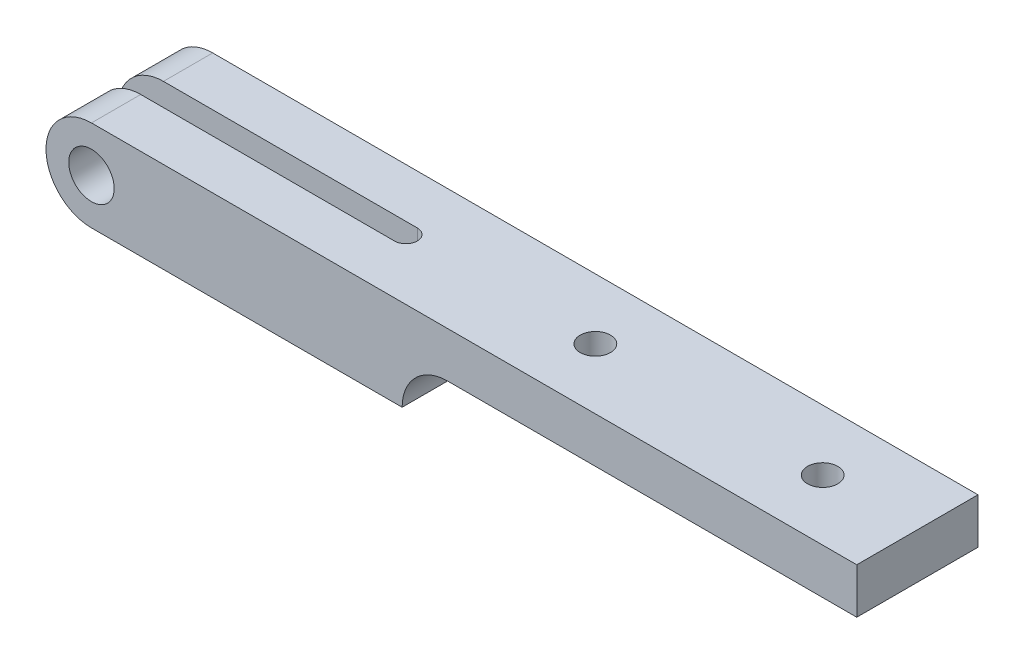
ISO-10303-21;
HEADER;
FILE_DESCRIPTION(('STEP AP214'),'2;1');
FILE_NAME('part.step','',(''),(''),'','','');
FILE_SCHEMA(('AUTOMOTIVE_DESIGN { 1 0 10303 214 1 1 1 1 }'));
ENDSEC;
DATA;
#1=APPLICATION_CONTEXT('core data for automotive mechanical design processes');
#2=APPLICATION_PROTOCOL_DEFINITION('international standard','automotive_design',2000,#1);
#3=PRODUCT_CONTEXT('',#1,'mechanical');
#4=PRODUCT('Part','Part','',(#3));
#5=PRODUCT_RELATED_PRODUCT_CATEGORY('part','',(#4));
#6=PRODUCT_DEFINITION_FORMATION('','',#4);
#7=PRODUCT_DEFINITION_CONTEXT('part definition',#1,'design');
#8=PRODUCT_DEFINITION('design','',#6,#7);
#9=PRODUCT_DEFINITION_SHAPE('','',#8);
#10=(LENGTH_UNIT() NAMED_UNIT(*) SI_UNIT(.MILLI.,.METRE.));
#11=(NAMED_UNIT(*) PLANE_ANGLE_UNIT() SI_UNIT($,.RADIAN.));
#12=(NAMED_UNIT(*) SI_UNIT($,.STERADIAN.) SOLID_ANGLE_UNIT());
#13=UNCERTAINTY_MEASURE_WITH_UNIT(LENGTH_MEASURE(1.E-05),#10,'distance_accuracy_value','');
#14=(GEOMETRIC_REPRESENTATION_CONTEXT(3) GLOBAL_UNCERTAINTY_ASSIGNED_CONTEXT((#13)) GLOBAL_UNIT_ASSIGNED_CONTEXT((#10,
#11,#12)) REPRESENTATION_CONTEXT('',''));
#15=CARTESIAN_POINT('',(0.,0.,0.));
#16=DIRECTION('',(0.,0.,1.));
#17=DIRECTION('',(1.,0.,0.));
#18=AXIS2_PLACEMENT_3D('',#15,#16,#17);
#19=CARTESIAN_POINT('',(0.,0.,8.));
#20=DIRECTION('',(0.,0.,-1.));
#21=DIRECTION('',(-1.,0.,0.));
#22=AXIS2_PLACEMENT_3D('',#19,#20,#21);
#23=CYLINDRICAL_SURFACE('',#22,3.);
#24=CARTESIAN_POINT('',(0.,0.,-1.5));
#25=DIRECTION('',(0.,0.,-1.));
#26=DIRECTION('',(-1.,0.,0.));
#27=AXIS2_PLACEMENT_3D('',#24,#25,#26);
#28=CIRCLE('',#27,3.);
#29=CARTESIAN_POINT('',(-3.,0.,-1.5));
#30=VERTEX_POINT('',#29);
#31=EDGE_CURVE('E223',#30,#30,#28,.T.);
#32=ORIENTED_EDGE('',*,*,#31,.F.);
#33=EDGE_LOOP('',(#32));
#34=FACE_BOUND('',#33,.T.);
#35=CARTESIAN_POINT('',(0.,0.,-8.));
#36=DIRECTION('',(0.,0.,1.));
#37=DIRECTION('',(1.,0.,0.));
#38=AXIS2_PLACEMENT_3D('',#35,#36,#37);
#39=CIRCLE('',#38,3.);
#40=CARTESIAN_POINT('',(3.,0.,-8.));
#41=VERTEX_POINT('',#40);
#42=EDGE_CURVE('E136',#41,#41,#39,.T.);
#43=ORIENTED_EDGE('',*,*,#42,.F.);
#44=EDGE_LOOP('',(#43));
#45=FACE_BOUND('',#44,.T.);
#46=ADVANCED_FACE('F35',(#34,#45),#23,.F.);
#47=CARTESIAN_POINT('',(0.,0.,8.));
#48=DIRECTION('',(0.,0.,-1.));
#49=DIRECTION('',(-1.,0.,0.));
#50=AXIS2_PLACEMENT_3D('',#47,#48,#49);
#51=CYLINDRICAL_SURFACE('',#50,6.);
#52=CARTESIAN_POINT('',(0.,0.,-1.5));
#53=DIRECTION('',(0.,0.,-1.));
#54=DIRECTION('',(-1.,0.,0.));
#55=AXIS2_PLACEMENT_3D('',#52,#53,#54);
#56=CIRCLE('',#55,6.);
#57=CARTESIAN_POINT('',(0.,-6.,-1.5));
#58=VERTEX_POINT('',#57);
#59=CARTESIAN_POINT('',(0.,6.,-1.5));
#60=VERTEX_POINT('',#59);
#61=EDGE_CURVE('E11',#58,#60,#56,.T.);
#62=ORIENTED_EDGE('',*,*,#61,.T.);
#63=DIRECTION('',(0.,0.,-1.));
#64=VECTOR('',#63,1.);
#65=CARTESIAN_POINT('',(0.,6.,8.));
#66=LINE('',#65,#64);
#67=CARTESIAN_POINT('',(0.,6.,-8.));
#68=VERTEX_POINT('',#67);
#69=EDGE_CURVE('E157',#60,#68,#66,.T.);
#70=ORIENTED_EDGE('',*,*,#69,.T.);
#71=CARTESIAN_POINT('',(0.,0.,-8.));
#72=DIRECTION('',(0.,0.,1.));
#73=DIRECTION('',(1.,0.,0.));
#74=AXIS2_PLACEMENT_3D('',#71,#72,#73);
#75=CIRCLE('',#74,6.);
#76=CARTESIAN_POINT('',(0.,-6.,-8.));
#77=VERTEX_POINT('',#76);
#78=EDGE_CURVE('E151',#68,#77,#75,.T.);
#79=ORIENTED_EDGE('',*,*,#78,.T.);
#80=DIRECTION('',(0.,0.,-1.));
#81=VECTOR('',#80,1.);
#82=CARTESIAN_POINT('',(0.,-6.,8.));
#83=LINE('',#82,#81);
#84=EDGE_CURVE('E88',#58,#77,#83,.T.);
#85=ORIENTED_EDGE('',*,*,#84,.F.);
#86=EDGE_LOOP('',(#62,#70,#79,#85));
#87=FACE_BOUND('',#86,.T.);
#88=ADVANCED_FACE('F192',(#87),#51,.T.);
#89=CARTESIAN_POINT('',(0.,-6.,8.));
#90=DIRECTION('',(0.,1.,0.));
#91=DIRECTION('',(0.,0.,1.));
#92=AXIS2_PLACEMENT_3D('',#89,#90,#91);
#93=PLANE('',#92);
#94=CARTESIAN_POINT('',(33.5,-6.,0.));
#95=DIRECTION('',(0.,1.,0.));
#96=DIRECTION('',(0.,0.,-1.));
#97=AXIS2_PLACEMENT_3D('',#94,#95,#96);
#98=CIRCLE('',#97,1.50000000000007);
#99=CARTESIAN_POINT('',(33.4999995303875,-6.,1.5));
#100=VERTEX_POINT('',#99);
#101=CARTESIAN_POINT('',(33.4999995303875,-6.,-1.5));
#102=VERTEX_POINT('',#101);
#103=EDGE_CURVE('E203',#100,#102,#98,.T.);
#104=ORIENTED_EDGE('',*,*,#103,.T.);
#105=DIRECTION('',(-1.,0.,0.));
#106=VECTOR('',#105,1.);
#107=CARTESIAN_POINT('',(33.4999995303875,-6.,-1.5));
#108=LINE('',#107,#106);
#109=EDGE_CURVE('E214',#102,#58,#108,.T.);
#110=ORIENTED_EDGE('',*,*,#109,.T.);
#111=ORIENTED_EDGE('',*,*,#84,.T.);
#112=DIRECTION('',(1.,0.,0.));
#113=VECTOR('',#112,1.);
#114=CARTESIAN_POINT('',(0.,-6.,-8.));
#115=LINE('',#114,#113);
#116=CARTESIAN_POINT('',(41.,-6.,-8.));
#117=VERTEX_POINT('',#116);
#118=EDGE_CURVE('E139',#77,#117,#115,.T.);
#119=ORIENTED_EDGE('',*,*,#118,.T.);
#120=DIRECTION('',(0.,0.,-1.));
#121=VECTOR('',#120,1.);
#122=CARTESIAN_POINT('',(41.,-6.,8.));
#123=LINE('',#122,#121);
#124=CARTESIAN_POINT('',(41.,-6.,8.));
#125=VERTEX_POINT('',#124);
#126=EDGE_CURVE('E162',#125,#117,#123,.T.);
#127=ORIENTED_EDGE('',*,*,#126,.F.);
#128=DIRECTION('',(1.,0.,0.));
#129=VECTOR('',#128,1.);
#130=CARTESIAN_POINT('',(0.,-6.,8.));
#131=LINE('',#130,#129);
#132=CARTESIAN_POINT('',(0.,-6.,8.));
#133=VERTEX_POINT('',#132);
#134=EDGE_CURVE('E172',#133,#125,#131,.T.);
#135=ORIENTED_EDGE('',*,*,#134,.F.);
#136=CARTESIAN_POINT('',(0.,-6.,1.5));
#137=VERTEX_POINT('',#136);
#138=EDGE_CURVE('E154',#133,#137,#83,.T.);
#139=ORIENTED_EDGE('',*,*,#138,.T.);
#140=DIRECTION('',(1.,0.,0.));
#141=VECTOR('',#140,1.);
#142=CARTESIAN_POINT('',(33.4999995303875,-6.,1.5));
#143=LINE('',#142,#141);
#144=EDGE_CURVE('E50',#137,#100,#143,.T.);
#145=ORIENTED_EDGE('',*,*,#144,.T.);
#146=EDGE_LOOP('',(#104,#110,#111,#119,#127,#135,#139,#145));
#147=FACE_BOUND('',#146,.T.);
#148=ADVANCED_FACE('F169',(#147),#93,.F.);
#149=CARTESIAN_POINT('',(47.,-6.,8.));
#150=DIRECTION('',(0.,0.,-1.));
#151=DIRECTION('',(-1.,0.,0.));
#152=AXIS2_PLACEMENT_3D('',#149,#150,#151);
#153=CYLINDRICAL_SURFACE('',#152,6.);
#154=CARTESIAN_POINT('',(47.,-6.,-8.));
#155=DIRECTION('',(0.,0.,1.));
#156=DIRECTION('',(1.,0.,0.));
#157=AXIS2_PLACEMENT_3D('',#154,#155,#156);
#158=CIRCLE('',#157,6.);
#159=CARTESIAN_POINT('',(47.,0.,-8.));
#160=VERTEX_POINT('',#159);
#161=EDGE_CURVE('E142',#117,#160,#158,.F.);
#162=ORIENTED_EDGE('',*,*,#161,.T.);
#163=DIRECTION('',(0.,0.,-1.));
#164=VECTOR('',#163,1.);
#165=CARTESIAN_POINT('',(47.,0.,8.));
#166=LINE('',#165,#164);
#167=CARTESIAN_POINT('',(47.,0.,8.));
#168=VERTEX_POINT('',#167);
#169=EDGE_CURVE('E160',#168,#160,#166,.T.);
#170=ORIENTED_EDGE('',*,*,#169,.F.);
#171=CARTESIAN_POINT('',(47.,-6.,8.));
#172=DIRECTION('',(0.,0.,1.));
#173=DIRECTION('',(1.,0.,0.));
#174=AXIS2_PLACEMENT_3D('',#171,#172,#173);
#175=CIRCLE('',#174,6.);
#176=EDGE_CURVE('E97',#125,#168,#175,.F.);
#177=ORIENTED_EDGE('',*,*,#176,.F.);
#178=ORIENTED_EDGE('',*,*,#126,.T.);
#179=EDGE_LOOP('',(#162,#170,#177,#178));
#180=FACE_BOUND('',#179,.T.);
#181=ADVANCED_FACE('F236',(#180),#153,.F.);
#182=CARTESIAN_POINT('',(0.,0.,8.));
#183=DIRECTION('',(0.,-1.,0.));
#184=DIRECTION('',(1.,0.,0.));
#185=AXIS2_PLACEMENT_3D('',#182,#183,#184);
#186=PLANE('',#185);
#187=CARTESIAN_POINT('',(58.5,0.,0.));
#188=DIRECTION('',(0.,-1.,0.));
#189=DIRECTION('',(1.,0.,0.));
#190=AXIS2_PLACEMENT_3D('',#187,#188,#189);
#191=CIRCLE('',#190,2.);
#192=CARTESIAN_POINT('',(60.5,0.,0.));
#193=VERTEX_POINT('',#192);
#194=EDGE_CURVE('E140',#193,#193,#191,.T.);
#195=ORIENTED_EDGE('',*,*,#194,.F.);
#196=EDGE_LOOP('',(#195));
#197=FACE_BOUND('',#196,.T.);
#198=CARTESIAN_POINT('',(88.5,0.,0.));
#199=DIRECTION('',(0.,-1.,0.));
#200=DIRECTION('',(1.,0.,0.));
#201=AXIS2_PLACEMENT_3D('',#198,#199,#200);
#202=CIRCLE('',#201,2.);
#203=CARTESIAN_POINT('',(90.5,0.,0.));
#204=VERTEX_POINT('',#203);
#205=EDGE_CURVE('E226',#204,#204,#202,.T.);
#206=ORIENTED_EDGE('',*,*,#205,.F.);
#207=EDGE_LOOP('',(#206));
#208=FACE_BOUND('',#207,.T.);
#209=DIRECTION('',(-1.,0.,0.));
#210=VECTOR('',#209,1.);
#211=CARTESIAN_POINT('',(0.,0.,-8.));
#212=LINE('',#211,#210);
#213=CARTESIAN_POINT('',(101.,0.,-8.));
#214=VERTEX_POINT('',#213);
#215=EDGE_CURVE('E145',#214,#160,#212,.T.);
#216=ORIENTED_EDGE('',*,*,#215,.F.);
#217=DIRECTION('',(0.,0.,-1.));
#218=VECTOR('',#217,1.);
#219=CARTESIAN_POINT('',(101.,0.,8.));
#220=LINE('',#219,#218);
#221=CARTESIAN_POINT('',(101.,0.,8.));
#222=VERTEX_POINT('',#221);
#223=EDGE_CURVE('E124',#222,#214,#220,.T.);
#224=ORIENTED_EDGE('',*,*,#223,.F.);
#225=DIRECTION('',(-1.,0.,0.));
#226=VECTOR('',#225,1.);
#227=CARTESIAN_POINT('',(0.,0.,8.));
#228=LINE('',#227,#226);
#229=EDGE_CURVE('E113',#222,#168,#228,.T.);
#230=ORIENTED_EDGE('',*,*,#229,.T.);
#231=ORIENTED_EDGE('',*,*,#169,.T.);
#232=EDGE_LOOP('',(#216,#224,#230,#231));
#233=FACE_BOUND('',#232,.T.);
#234=ADVANCED_FACE('F180',(#197,#208,#233),#186,.T.);
#235=CARTESIAN_POINT('',(101.,0.,8.));
#236=DIRECTION('',(-1.,0.,0.));
#237=DIRECTION('',(0.,0.,1.));
#238=AXIS2_PLACEMENT_3D('',#235,#236,#237);
#239=PLANE('',#238);
#240=DIRECTION('',(0.,1.,0.));
#241=VECTOR('',#240,1.);
#242=CARTESIAN_POINT('',(101.,0.,-8.));
#243=LINE('',#242,#241);
#244=CARTESIAN_POINT('',(101.,6.,-8.));
#245=VERTEX_POINT('',#244);
#246=EDGE_CURVE('E120',#214,#245,#243,.T.);
#247=ORIENTED_EDGE('',*,*,#246,.T.);
#248=DIRECTION('',(0.,0.,-1.));
#249=VECTOR('',#248,1.);
#250=CARTESIAN_POINT('',(101.,6.,8.));
#251=LINE('',#250,#249);
#252=CARTESIAN_POINT('',(101.,6.,8.));
#253=VERTEX_POINT('',#252);
#254=EDGE_CURVE('E117',#253,#245,#251,.T.);
#255=ORIENTED_EDGE('',*,*,#254,.F.);
#256=DIRECTION('',(0.,1.,0.));
#257=VECTOR('',#256,1.);
#258=CARTESIAN_POINT('',(101.,0.,8.));
#259=LINE('',#258,#257);
#260=EDGE_CURVE('E107',#222,#253,#259,.T.);
#261=ORIENTED_EDGE('',*,*,#260,.F.);
#262=ORIENTED_EDGE('',*,*,#223,.T.);
#263=EDGE_LOOP('',(#247,#255,#261,#262));
#264=FACE_BOUND('',#263,.T.);
#265=ADVANCED_FACE('F118',(#264),#239,.F.);
#266=CARTESIAN_POINT('',(0.,6.,8.));
#267=DIRECTION('',(0.,1.,0.));
#268=DIRECTION('',(0.,0.,1.));
#269=AXIS2_PLACEMENT_3D('',#266,#267,#268);
#270=PLANE('',#269);
#271=DIRECTION('',(-1.,0.,0.));
#272=VECTOR('',#271,1.);
#273=CARTESIAN_POINT('',(33.4999995303875,6.,-1.5));
#274=LINE('',#273,#272);
#275=CARTESIAN_POINT('',(33.4999995303875,6.,-1.5));
#276=VERTEX_POINT('',#275);
#277=EDGE_CURVE('E190',#276,#60,#274,.T.);
#278=ORIENTED_EDGE('',*,*,#277,.F.);
#279=CARTESIAN_POINT('',(33.5,6.,0.));
#280=DIRECTION('',(0.,1.,0.));
#281=DIRECTION('',(0.,0.,-1.));
#282=AXIS2_PLACEMENT_3D('',#279,#280,#281);
#283=CIRCLE('',#282,1.50000000000007);
#284=CARTESIAN_POINT('',(33.4999995303875,6.,1.5));
#285=VERTEX_POINT('',#284);
#286=EDGE_CURVE('E201',#285,#276,#283,.T.);
#287=ORIENTED_EDGE('',*,*,#286,.F.);
#288=DIRECTION('',(1.,0.,0.));
#289=VECTOR('',#288,1.);
#290=CARTESIAN_POINT('',(33.4999995303875,6.,1.5));
#291=LINE('',#290,#289);
#292=CARTESIAN_POINT('',(0.,6.,1.5));
#293=VERTEX_POINT('',#292);
#294=EDGE_CURVE('E205',#293,#285,#291,.T.);
#295=ORIENTED_EDGE('',*,*,#294,.F.);
#296=CARTESIAN_POINT('',(0.,6.,8.));
#297=VERTEX_POINT('',#296);
#298=EDGE_CURVE('E125',#297,#293,#66,.T.);
#299=ORIENTED_EDGE('',*,*,#298,.F.);
#300=DIRECTION('',(1.,0.,0.));
#301=VECTOR('',#300,1.);
#302=CARTESIAN_POINT('',(0.,6.,8.));
#303=LINE('',#302,#301);
#304=EDGE_CURVE('E111',#297,#253,#303,.T.);
#305=ORIENTED_EDGE('',*,*,#304,.T.);
#306=ORIENTED_EDGE('',*,*,#254,.T.);
#307=DIRECTION('',(1.,0.,0.));
#308=VECTOR('',#307,1.);
#309=CARTESIAN_POINT('',(0.,6.,-8.));
#310=LINE('',#309,#308);
#311=EDGE_CURVE('E149',#68,#245,#310,.T.);
#312=ORIENTED_EDGE('',*,*,#311,.F.);
#313=ORIENTED_EDGE('',*,*,#69,.F.);
#314=EDGE_LOOP('',(#278,#287,#295,#299,#305,#306,#312,#313));
#315=FACE_BOUND('',#314,.T.);
#316=CARTESIAN_POINT('',(58.5,6.,0.));
#317=DIRECTION('',(0.,1.,0.));
#318=DIRECTION('',(0.,0.,1.));
#319=AXIS2_PLACEMENT_3D('',#316,#317,#318);
#320=CIRCLE('',#319,2.);
#321=CARTESIAN_POINT('',(58.5,6.,2.));
#322=VERTEX_POINT('',#321);
#323=EDGE_CURVE('E215',#322,#322,#320,.T.);
#324=ORIENTED_EDGE('',*,*,#323,.F.);
#325=EDGE_LOOP('',(#324));
#326=FACE_BOUND('',#325,.T.);
#327=CARTESIAN_POINT('',(88.5,6.,0.));
#328=DIRECTION('',(0.,1.,0.));
#329=DIRECTION('',(0.,0.,1.));
#330=AXIS2_PLACEMENT_3D('',#327,#328,#329);
#331=CIRCLE('',#330,2.);
#332=CARTESIAN_POINT('',(88.5,6.,1.99999999999999));
#333=VERTEX_POINT('',#332);
#334=EDGE_CURVE('E218',#333,#333,#331,.T.);
#335=ORIENTED_EDGE('',*,*,#334,.F.);
#336=EDGE_LOOP('',(#335));
#337=FACE_BOUND('',#336,.T.);
#338=ADVANCED_FACE('F128',(#315,#326,#337),#270,.T.);
#339=CARTESIAN_POINT('',(0.,0.,1.5));
#340=DIRECTION('',(0.,0.,1.));
#341=DIRECTION('',(1.,0.,0.));
#342=AXIS2_PLACEMENT_3D('',#339,#340,#341);
#343=CIRCLE('',#342,3.);
#344=CARTESIAN_POINT('',(3.,0.,1.5));
#345=VERTEX_POINT('',#344);
#346=EDGE_CURVE('E210',#345,#345,#343,.T.);
#347=ORIENTED_EDGE('',*,*,#346,.F.);
#348=EDGE_LOOP('',(#347));
#349=FACE_BOUND('',#348,.T.);
#350=CARTESIAN_POINT('',(0.,0.,8.));
#351=DIRECTION('',(0.,0.,1.));
#352=DIRECTION('',(1.,0.,0.));
#353=AXIS2_PLACEMENT_3D('',#350,#351,#352);
#354=CIRCLE('',#353,3.);
#355=CARTESIAN_POINT('',(3.,0.,8.));
#356=VERTEX_POINT('',#355);
#357=EDGE_CURVE('E153',#356,#356,#354,.T.);
#358=ORIENTED_EDGE('',*,*,#357,.T.);
#359=EDGE_LOOP('',(#358));
#360=FACE_BOUND('',#359,.T.);
#361=ADVANCED_FACE('F37',(#349,#360),#23,.F.);
#362=ORIENTED_EDGE('',*,*,#298,.T.);
#363=CARTESIAN_POINT('',(0.,0.,1.5));
#364=DIRECTION('',(0.,0.,1.));
#365=DIRECTION('',(1.,0.,0.));
#366=AXIS2_PLACEMENT_3D('',#363,#364,#365);
#367=CIRCLE('',#366,6.);
#368=EDGE_CURVE('E43',#293,#137,#367,.T.);
#369=ORIENTED_EDGE('',*,*,#368,.T.);
#370=ORIENTED_EDGE('',*,*,#138,.F.);
#371=CARTESIAN_POINT('',(0.,0.,8.));
#372=DIRECTION('',(0.,0.,1.));
#373=DIRECTION('',(1.,0.,0.));
#374=AXIS2_PLACEMENT_3D('',#371,#372,#373);
#375=CIRCLE('',#374,6.);
#376=EDGE_CURVE('E59',#297,#133,#375,.T.);
#377=ORIENTED_EDGE('',*,*,#376,.F.);
#378=EDGE_LOOP('',(#362,#369,#370,#377));
#379=FACE_BOUND('',#378,.T.);
#380=ADVANCED_FACE('F164',(#379),#51,.T.);
#381=CARTESIAN_POINT('',(0.,0.,8.));
#382=DIRECTION('',(0.,0.,1.));
#383=DIRECTION('',(1.,0.,0.));
#384=AXIS2_PLACEMENT_3D('',#381,#382,#383);
#385=PLANE('',#384);
#386=ORIENTED_EDGE('',*,*,#357,.F.);
#387=EDGE_LOOP('',(#386));
#388=FACE_BOUND('',#387,.T.);
#389=ORIENTED_EDGE('',*,*,#134,.T.);
#390=ORIENTED_EDGE('',*,*,#176,.T.);
#391=ORIENTED_EDGE('',*,*,#229,.F.);
#392=ORIENTED_EDGE('',*,*,#260,.T.);
#393=ORIENTED_EDGE('',*,*,#304,.F.);
#394=ORIENTED_EDGE('',*,*,#376,.T.);
#395=EDGE_LOOP('',(#389,#390,#391,#392,#393,#394));
#396=FACE_BOUND('',#395,.T.);
#397=ADVANCED_FACE('F109',(#388,#396),#385,.T.);
#398=CARTESIAN_POINT('',(0.,0.,-8.));
#399=DIRECTION('',(0.,0.,1.));
#400=DIRECTION('',(1.,0.,0.));
#401=AXIS2_PLACEMENT_3D('',#398,#399,#400);
#402=PLANE('',#401);
#403=ORIENTED_EDGE('',*,*,#42,.T.);
#404=EDGE_LOOP('',(#403));
#405=FACE_BOUND('',#404,.T.);
#406=ORIENTED_EDGE('',*,*,#118,.F.);
#407=ORIENTED_EDGE('',*,*,#78,.F.);
#408=ORIENTED_EDGE('',*,*,#311,.T.);
#409=ORIENTED_EDGE('',*,*,#246,.F.);
#410=ORIENTED_EDGE('',*,*,#215,.T.);
#411=ORIENTED_EDGE('',*,*,#161,.F.);
#412=EDGE_LOOP('',(#406,#407,#408,#409,#410,#411));
#413=FACE_BOUND('',#412,.T.);
#414=ADVANCED_FACE('F183',(#405,#413),#402,.F.);
#415=CARTESIAN_POINT('',(33.4999995303875,-6.,-1.5));
#416=DIRECTION('',(0.,0.,-1.));
#417=DIRECTION('',(-1.,0.,0.));
#418=AXIS2_PLACEMENT_3D('',#415,#416,#417);
#419=PLANE('',#418);
#420=ORIENTED_EDGE('',*,*,#31,.T.);
#421=EDGE_LOOP('',(#420));
#422=FACE_BOUND('',#421,.T.);
#423=ORIENTED_EDGE('',*,*,#61,.F.);
#424=ORIENTED_EDGE('',*,*,#109,.F.);
#425=DIRECTION('',(0.,1.,0.));
#426=VECTOR('',#425,1.);
#427=CARTESIAN_POINT('',(33.4999995303875,-6.,-1.5));
#428=LINE('',#427,#426);
#429=EDGE_CURVE('E199',#102,#276,#428,.T.);
#430=ORIENTED_EDGE('',*,*,#429,.T.);
#431=ORIENTED_EDGE('',*,*,#277,.T.);
#432=EDGE_LOOP('',(#423,#424,#430,#431));
#433=FACE_BOUND('',#432,.T.);
#434=ADVANCED_FACE('F197',(#422,#433),#419,.F.);
#435=CARTESIAN_POINT('',(33.4999995303875,-6.,1.5));
#436=DIRECTION('',(0.,0.,1.));
#437=DIRECTION('',(1.,0.,0.));
#438=AXIS2_PLACEMENT_3D('',#435,#436,#437);
#439=PLANE('',#438);
#440=ORIENTED_EDGE('',*,*,#346,.T.);
#441=EDGE_LOOP('',(#440));
#442=FACE_BOUND('',#441,.T.);
#443=ORIENTED_EDGE('',*,*,#294,.T.);
#444=DIRECTION('',(0.,1.,0.));
#445=VECTOR('',#444,1.);
#446=CARTESIAN_POINT('',(33.4999995303875,-6.,1.5));
#447=LINE('',#446,#445);
#448=EDGE_CURVE('E211',#100,#285,#447,.T.);
#449=ORIENTED_EDGE('',*,*,#448,.F.);
#450=ORIENTED_EDGE('',*,*,#144,.F.);
#451=ORIENTED_EDGE('',*,*,#368,.F.);
#452=EDGE_LOOP('',(#443,#449,#450,#451));
#453=FACE_BOUND('',#452,.T.);
#454=ADVANCED_FACE('F271',(#442,#453),#439,.F.);
#455=CARTESIAN_POINT('',(33.5,-6.,0.));
#456=DIRECTION('',(0.,1.,0.));
#457=DIRECTION('',(0.,0.,1.));
#458=AXIS2_PLACEMENT_3D('',#455,#456,#457);
#459=CYLINDRICAL_SURFACE('',#458,1.50000000000007);
#460=ORIENTED_EDGE('',*,*,#286,.T.);
#461=ORIENTED_EDGE('',*,*,#429,.F.);
#462=ORIENTED_EDGE('',*,*,#103,.F.);
#463=ORIENTED_EDGE('',*,*,#448,.T.);
#464=EDGE_LOOP('',(#460,#461,#462,#463));
#465=FACE_BOUND('',#464,.T.);
#466=ADVANCED_FACE('F243',(#465),#459,.F.);
#467=CARTESIAN_POINT('',(88.5,-6.,0.));
#468=DIRECTION('',(0.,1.,0.));
#469=DIRECTION('',(0.,0.,1.));
#470=AXIS2_PLACEMENT_3D('',#467,#468,#469);
#471=CYLINDRICAL_SURFACE('',#470,2.);
#472=ORIENTED_EDGE('',*,*,#205,.T.);
#473=EDGE_LOOP('',(#472));
#474=FACE_BOUND('',#473,.T.);
#475=ORIENTED_EDGE('',*,*,#334,.T.);
#476=EDGE_LOOP('',(#475));
#477=FACE_BOUND('',#476,.T.);
#478=ADVANCED_FACE('F240',(#474,#477),#471,.F.);
#479=CARTESIAN_POINT('',(58.5,-6.,0.));
#480=DIRECTION('',(0.,1.,0.));
#481=DIRECTION('',(0.,0.,1.));
#482=AXIS2_PLACEMENT_3D('',#479,#480,#481);
#483=CYLINDRICAL_SURFACE('',#482,2.);
#484=ORIENTED_EDGE('',*,*,#194,.T.);
#485=EDGE_LOOP('',(#484));
#486=FACE_BOUND('',#485,.T.);
#487=ORIENTED_EDGE('',*,*,#323,.T.);
#488=EDGE_LOOP('',(#487));
#489=FACE_BOUND('',#488,.T.);
#490=ADVANCED_FACE('F231',(#486,#489),#483,.F.);
#491=CLOSED_SHELL('',(#46,#88,#148,#181,#234,#265,#338,#361,#380,#397,#414,#434,#454,#466,#478,#490));
#492=MANIFOLD_SOLID_BREP('B2',#491);
#493=ADVANCED_BREP_SHAPE_REPRESENTATION('',(#18,#492),#14);
#494=SHAPE_DEFINITION_REPRESENTATION(#9,#493);
ENDSEC;
END-ISO-10303-21;
